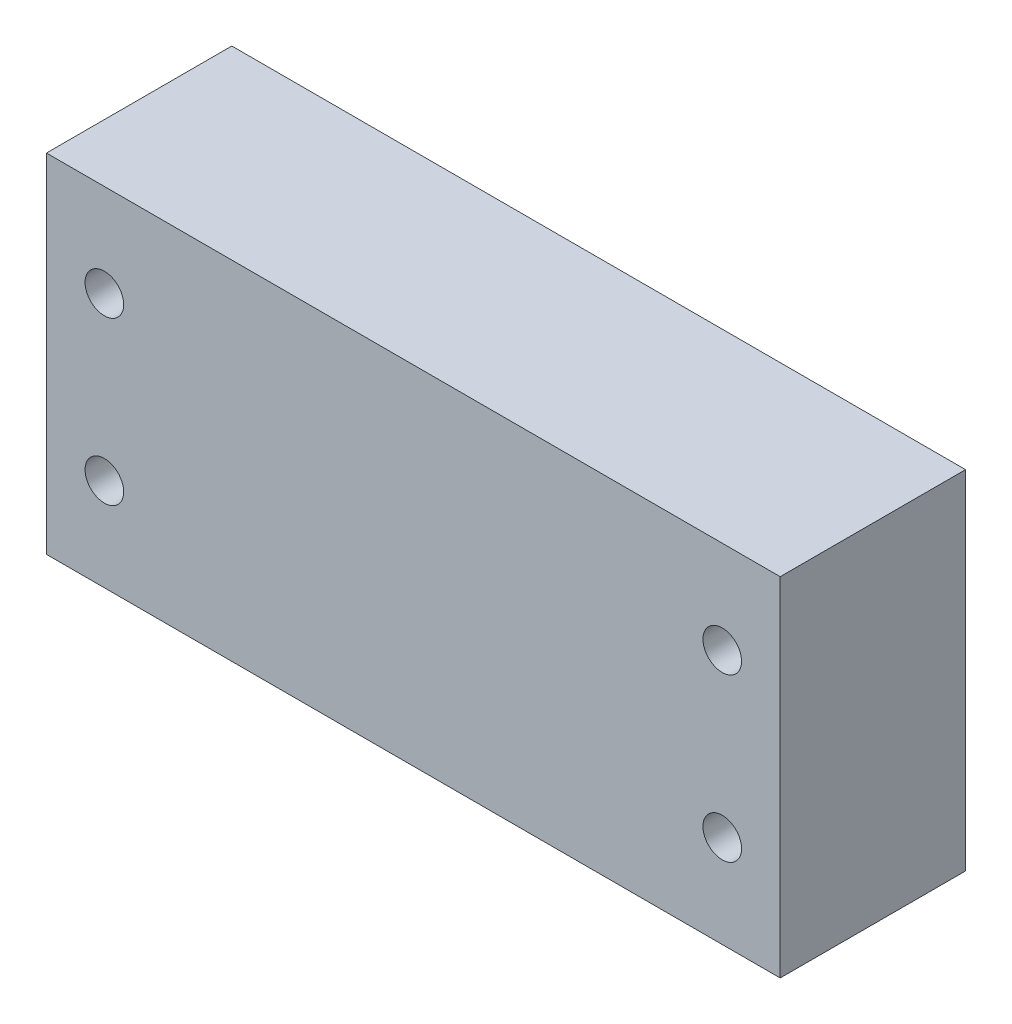
ISO-10303-21;
HEADER;
FILE_DESCRIPTION(('STEP AP214'),'2;1');
FILE_NAME('part.step','',(''),(''),'','','');
FILE_SCHEMA(('AUTOMOTIVE_DESIGN { 1 0 10303 214 1 1 1 1 }'));
ENDSEC;
DATA;
#1=APPLICATION_CONTEXT('core data for automotive mechanical design processes');
#2=APPLICATION_PROTOCOL_DEFINITION('international standard','automotive_design',2000,#1);
#3=PRODUCT_CONTEXT('',#1,'mechanical');
#4=PRODUCT('Part','Part','',(#3));
#5=PRODUCT_RELATED_PRODUCT_CATEGORY('part','',(#4));
#6=PRODUCT_DEFINITION_FORMATION('','',#4);
#7=PRODUCT_DEFINITION_CONTEXT('part definition',#1,'design');
#8=PRODUCT_DEFINITION('design','',#6,#7);
#9=PRODUCT_DEFINITION_SHAPE('','',#8);
#10=(LENGTH_UNIT() NAMED_UNIT(*) SI_UNIT(.MILLI.,.METRE.));
#11=(NAMED_UNIT(*) PLANE_ANGLE_UNIT() SI_UNIT($,.RADIAN.));
#12=(NAMED_UNIT(*) SI_UNIT($,.STERADIAN.) SOLID_ANGLE_UNIT());
#13=UNCERTAINTY_MEASURE_WITH_UNIT(LENGTH_MEASURE(1.E-05),#10,'distance_accuracy_value','');
#14=(GEOMETRIC_REPRESENTATION_CONTEXT(3) GLOBAL_UNCERTAINTY_ASSIGNED_CONTEXT((#13)) GLOBAL_UNIT_ASSIGNED_CONTEXT((#10,
#11,#12)) REPRESENTATION_CONTEXT('',''));
#15=CARTESIAN_POINT('',(0.,0.,0.));
#16=DIRECTION('',(0.,0.,1.));
#17=DIRECTION('',(1.,0.,0.));
#18=AXIS2_PLACEMENT_3D('',#15,#16,#17);
#19=CARTESIAN_POINT('',(47.5,22.5,24.));
#20=DIRECTION('',(-1.,0.,0.));
#21=DIRECTION('',(0.,-1.,0.));
#22=AXIS2_PLACEMENT_3D('',#19,#20,#21);
#23=PLANE('',#22);
#24=DIRECTION('',(0.,1.,0.));
#25=VECTOR('',#24,1.);
#26=CARTESIAN_POINT('',(47.5,22.5,0.));
#27=LINE('',#26,#25);
#28=CARTESIAN_POINT('',(47.5,-22.5,0.));
#29=VERTEX_POINT('',#28);
#30=CARTESIAN_POINT('',(47.5,22.5,0.));
#31=VERTEX_POINT('',#30);
#32=EDGE_CURVE('E96',#29,#31,#27,.T.);
#33=ORIENTED_EDGE('',*,*,#32,.T.);
#34=DIRECTION('',(0.,0.,-1.));
#35=VECTOR('',#34,1.);
#36=CARTESIAN_POINT('',(47.5,22.5,24.));
#37=LINE('',#36,#35);
#38=CARTESIAN_POINT('',(47.5,22.5,24.));
#39=VERTEX_POINT('',#38);
#40=EDGE_CURVE('E11',#39,#31,#37,.T.);
#41=ORIENTED_EDGE('',*,*,#40,.F.);
#42=DIRECTION('',(0.,1.,0.));
#43=VECTOR('',#42,1.);
#44=CARTESIAN_POINT('',(47.5,22.5,24.));
#45=LINE('',#44,#43);
#46=CARTESIAN_POINT('',(47.5,-22.5,24.));
#47=VERTEX_POINT('',#46);
#48=EDGE_CURVE('E84',#47,#39,#45,.T.);
#49=ORIENTED_EDGE('',*,*,#48,.F.);
#50=DIRECTION('',(0.,0.,-1.));
#51=VECTOR('',#50,1.);
#52=CARTESIAN_POINT('',(47.5,-22.5,24.));
#53=LINE('',#52,#51);
#54=EDGE_CURVE('E92',#47,#29,#53,.T.);
#55=ORIENTED_EDGE('',*,*,#54,.T.);
#56=EDGE_LOOP('',(#33,#41,#49,#55));
#57=FACE_BOUND('',#56,.T.);
#58=ADVANCED_FACE('F33',(#57),#23,.F.);
#59=CARTESIAN_POINT('',(-47.5,22.5,24.));
#60=DIRECTION('',(0.,-1.,0.));
#61=DIRECTION('',(0.,0.,-1.));
#62=AXIS2_PLACEMENT_3D('',#59,#60,#61);
#63=PLANE('',#62);
#64=DIRECTION('',(-1.,0.,0.));
#65=VECTOR('',#64,1.);
#66=CARTESIAN_POINT('',(-47.5,22.5,0.));
#67=LINE('',#66,#65);
#68=CARTESIAN_POINT('',(-47.5,22.5,0.));
#69=VERTEX_POINT('',#68);
#70=EDGE_CURVE('E88',#31,#69,#67,.T.);
#71=ORIENTED_EDGE('',*,*,#70,.T.);
#72=DIRECTION('',(0.,0.,-1.));
#73=VECTOR('',#72,1.);
#74=CARTESIAN_POINT('',(-47.5,22.5,24.));
#75=LINE('',#74,#73);
#76=CARTESIAN_POINT('',(-47.5,22.5,24.));
#77=VERTEX_POINT('',#76);
#78=EDGE_CURVE('E41',#77,#69,#75,.T.);
#79=ORIENTED_EDGE('',*,*,#78,.F.);
#80=DIRECTION('',(-1.,0.,0.));
#81=VECTOR('',#80,1.);
#82=CARTESIAN_POINT('',(-47.5,22.5,24.));
#83=LINE('',#82,#81);
#84=EDGE_CURVE('E79',#39,#77,#83,.T.);
#85=ORIENTED_EDGE('',*,*,#84,.F.);
#86=ORIENTED_EDGE('',*,*,#40,.T.);
#87=EDGE_LOOP('',(#71,#79,#85,#86));
#88=FACE_BOUND('',#87,.T.);
#89=ADVANCED_FACE('F87',(#88),#63,.F.);
#90=CARTESIAN_POINT('',(-47.5,22.5,24.));
#91=DIRECTION('',(1.,0.,0.));
#92=DIRECTION('',(0.,0.,-1.));
#93=AXIS2_PLACEMENT_3D('',#90,#91,#92);
#94=PLANE('',#93);
#95=DIRECTION('',(0.,-1.,0.));
#96=VECTOR('',#95,1.);
#97=CARTESIAN_POINT('',(-47.5,22.5,0.));
#98=LINE('',#97,#96);
#99=CARTESIAN_POINT('',(-47.5,-22.5,0.));
#100=VERTEX_POINT('',#99);
#101=EDGE_CURVE('E66',#69,#100,#98,.T.);
#102=ORIENTED_EDGE('',*,*,#101,.T.);
#103=DIRECTION('',(0.,0.,-1.));
#104=VECTOR('',#103,1.);
#105=CARTESIAN_POINT('',(-47.5,-22.5,24.));
#106=LINE('',#105,#104);
#107=CARTESIAN_POINT('',(-47.5,-22.5,24.));
#108=VERTEX_POINT('',#107);
#109=EDGE_CURVE('E89',#108,#100,#106,.T.);
#110=ORIENTED_EDGE('',*,*,#109,.F.);
#111=DIRECTION('',(0.,-1.,0.));
#112=VECTOR('',#111,1.);
#113=CARTESIAN_POINT('',(-47.5,22.5,24.));
#114=LINE('',#113,#112);
#115=EDGE_CURVE('E82',#77,#108,#114,.T.);
#116=ORIENTED_EDGE('',*,*,#115,.F.);
#117=ORIENTED_EDGE('',*,*,#78,.T.);
#118=EDGE_LOOP('',(#102,#110,#116,#117));
#119=FACE_BOUND('',#118,.T.);
#120=ADVANCED_FACE('F90',(#119),#94,.F.);
#121=CARTESIAN_POINT('',(-47.5,-22.5,24.));
#122=DIRECTION('',(0.,1.,0.));
#123=DIRECTION('',(0.,0.,1.));
#124=AXIS2_PLACEMENT_3D('',#121,#122,#123);
#125=PLANE('',#124);
#126=DIRECTION('',(1.,0.,0.));
#127=VECTOR('',#126,1.);
#128=CARTESIAN_POINT('',(-47.5,-22.5,0.));
#129=LINE('',#128,#127);
#130=EDGE_CURVE('E72',#100,#29,#129,.T.);
#131=ORIENTED_EDGE('',*,*,#130,.T.);
#132=ORIENTED_EDGE('',*,*,#54,.F.);
#133=DIRECTION('',(1.,0.,0.));
#134=VECTOR('',#133,1.);
#135=CARTESIAN_POINT('',(-47.5,-22.5,24.));
#136=LINE('',#135,#134);
#137=EDGE_CURVE('E49',#108,#47,#136,.T.);
#138=ORIENTED_EDGE('',*,*,#137,.F.);
#139=ORIENTED_EDGE('',*,*,#109,.T.);
#140=EDGE_LOOP('',(#131,#132,#138,#139));
#141=FACE_BOUND('',#140,.T.);
#142=ADVANCED_FACE('F104',(#141),#125,.F.);
#143=CARTESIAN_POINT('',(0.,0.,24.));
#144=DIRECTION('',(0.,0.,1.));
#145=DIRECTION('',(1.,0.,0.));
#146=AXIS2_PLACEMENT_3D('',#143,#144,#145);
#147=PLANE('',#146);
#148=CARTESIAN_POINT('',(40.,10.5,24.));
#149=DIRECTION('',(0.,0.,1.));
#150=DIRECTION('',(1.,0.,0.));
#151=AXIS2_PLACEMENT_3D('',#148,#149,#150);
#152=CIRCLE('',#151,2.5);
#153=CARTESIAN_POINT('',(42.5,10.5,24.));
#154=VERTEX_POINT('',#153);
#155=EDGE_CURVE('E128',#154,#154,#152,.T.);
#156=ORIENTED_EDGE('',*,*,#155,.F.);
#157=EDGE_LOOP('',(#156));
#158=FACE_BOUND('',#157,.T.);
#159=CARTESIAN_POINT('',(40.,-10.5,24.));
#160=DIRECTION('',(0.,0.,1.));
#161=DIRECTION('',(1.,0.,0.));
#162=AXIS2_PLACEMENT_3D('',#159,#160,#161);
#163=CIRCLE('',#162,2.5);
#164=CARTESIAN_POINT('',(42.5,-10.5,24.));
#165=VERTEX_POINT('',#164);
#166=EDGE_CURVE('E122',#165,#165,#163,.T.);
#167=ORIENTED_EDGE('',*,*,#166,.F.);
#168=EDGE_LOOP('',(#167));
#169=FACE_BOUND('',#168,.T.);
#170=CARTESIAN_POINT('',(-40.,-10.5,24.));
#171=DIRECTION('',(0.,0.,1.));
#172=DIRECTION('',(1.,0.,0.));
#173=AXIS2_PLACEMENT_3D('',#170,#171,#172);
#174=CIRCLE('',#173,2.5);
#175=CARTESIAN_POINT('',(-37.5,-10.5,24.));
#176=VERTEX_POINT('',#175);
#177=EDGE_CURVE('E116',#176,#176,#174,.T.);
#178=ORIENTED_EDGE('',*,*,#177,.F.);
#179=EDGE_LOOP('',(#178));
#180=FACE_BOUND('',#179,.T.);
#181=CARTESIAN_POINT('',(-40.,10.5,24.));
#182=DIRECTION('',(0.,0.,1.));
#183=DIRECTION('',(1.,0.,0.));
#184=AXIS2_PLACEMENT_3D('',#181,#182,#183);
#185=CIRCLE('',#184,2.5);
#186=CARTESIAN_POINT('',(-37.5,10.5,24.));
#187=VERTEX_POINT('',#186);
#188=EDGE_CURVE('E110',#187,#187,#185,.T.);
#189=ORIENTED_EDGE('',*,*,#188,.F.);
#190=EDGE_LOOP('',(#189));
#191=FACE_BOUND('',#190,.T.);
#192=ORIENTED_EDGE('',*,*,#48,.T.);
#193=ORIENTED_EDGE('',*,*,#84,.T.);
#194=ORIENTED_EDGE('',*,*,#115,.T.);
#195=ORIENTED_EDGE('',*,*,#137,.T.);
#196=EDGE_LOOP('',(#192,#193,#194,#195));
#197=FACE_BOUND('',#196,.T.);
#198=ADVANCED_FACE('F80',(#158,#169,#180,#191,#197),#147,.T.);
#199=CARTESIAN_POINT('',(0.,0.,0.));
#200=DIRECTION('',(0.,0.,1.));
#201=DIRECTION('',(1.,0.,0.));
#202=AXIS2_PLACEMENT_3D('',#199,#200,#201);
#203=PLANE('',#202);
#204=CARTESIAN_POINT('',(40.,10.5,0.));
#205=DIRECTION('',(0.,0.,1.));
#206=DIRECTION('',(1.,0.,0.));
#207=AXIS2_PLACEMENT_3D('',#204,#205,#206);
#208=CIRCLE('',#207,2.5);
#209=CARTESIAN_POINT('',(42.5,10.5,0.));
#210=VERTEX_POINT('',#209);
#211=EDGE_CURVE('E125',#210,#210,#208,.T.);
#212=ORIENTED_EDGE('',*,*,#211,.T.);
#213=EDGE_LOOP('',(#212));
#214=FACE_BOUND('',#213,.T.);
#215=CARTESIAN_POINT('',(40.,-10.5,0.));
#216=DIRECTION('',(0.,0.,1.));
#217=DIRECTION('',(1.,0.,0.));
#218=AXIS2_PLACEMENT_3D('',#215,#216,#217);
#219=CIRCLE('',#218,2.5);
#220=CARTESIAN_POINT('',(42.5,-10.5,0.));
#221=VERTEX_POINT('',#220);
#222=EDGE_CURVE('E119',#221,#221,#219,.T.);
#223=ORIENTED_EDGE('',*,*,#222,.T.);
#224=EDGE_LOOP('',(#223));
#225=FACE_BOUND('',#224,.T.);
#226=CARTESIAN_POINT('',(-40.,-10.5,0.));
#227=DIRECTION('',(0.,0.,1.));
#228=DIRECTION('',(1.,0.,0.));
#229=AXIS2_PLACEMENT_3D('',#226,#227,#228);
#230=CIRCLE('',#229,2.5);
#231=CARTESIAN_POINT('',(-37.5,-10.5,0.));
#232=VERTEX_POINT('',#231);
#233=EDGE_CURVE('E113',#232,#232,#230,.T.);
#234=ORIENTED_EDGE('',*,*,#233,.T.);
#235=EDGE_LOOP('',(#234));
#236=FACE_BOUND('',#235,.T.);
#237=CARTESIAN_POINT('',(-40.,10.5,0.));
#238=DIRECTION('',(0.,0.,1.));
#239=DIRECTION('',(1.,0.,0.));
#240=AXIS2_PLACEMENT_3D('',#237,#238,#239);
#241=CIRCLE('',#240,2.5);
#242=CARTESIAN_POINT('',(-37.5,10.5,0.));
#243=VERTEX_POINT('',#242);
#244=EDGE_CURVE('E99',#243,#243,#241,.T.);
#245=ORIENTED_EDGE('',*,*,#244,.T.);
#246=EDGE_LOOP('',(#245));
#247=FACE_BOUND('',#246,.T.);
#248=ORIENTED_EDGE('',*,*,#32,.F.);
#249=ORIENTED_EDGE('',*,*,#130,.F.);
#250=ORIENTED_EDGE('',*,*,#101,.F.);
#251=ORIENTED_EDGE('',*,*,#70,.F.);
#252=EDGE_LOOP('',(#248,#249,#250,#251));
#253=FACE_BOUND('',#252,.T.);
#254=ADVANCED_FACE('F107',(#214,#225,#236,#247,#253),#203,.F.);
#255=CARTESIAN_POINT('',(-40.,10.5,0.));
#256=DIRECTION('',(0.,0.,1.));
#257=DIRECTION('',(1.,0.,0.));
#258=AXIS2_PLACEMENT_3D('',#255,#256,#257);
#259=CYLINDRICAL_SURFACE('',#258,2.5);
#260=ORIENTED_EDGE('',*,*,#244,.F.);
#261=EDGE_LOOP('',(#260));
#262=FACE_BOUND('',#261,.T.);
#263=ORIENTED_EDGE('',*,*,#188,.T.);
#264=EDGE_LOOP('',(#263));
#265=FACE_BOUND('',#264,.T.);
#266=ADVANCED_FACE('F152',(#262,#265),#259,.F.);
#267=CARTESIAN_POINT('',(-40.,-10.5,0.));
#268=DIRECTION('',(0.,0.,1.));
#269=DIRECTION('',(1.,0.,0.));
#270=AXIS2_PLACEMENT_3D('',#267,#268,#269);
#271=CYLINDRICAL_SURFACE('',#270,2.5);
#272=ORIENTED_EDGE('',*,*,#233,.F.);
#273=EDGE_LOOP('',(#272));
#274=FACE_BOUND('',#273,.T.);
#275=ORIENTED_EDGE('',*,*,#177,.T.);
#276=EDGE_LOOP('',(#275));
#277=FACE_BOUND('',#276,.T.);
#278=ADVANCED_FACE('F154',(#274,#277),#271,.F.);
#279=CARTESIAN_POINT('',(40.,-10.5,0.));
#280=DIRECTION('',(0.,0.,1.));
#281=DIRECTION('',(1.,0.,0.));
#282=AXIS2_PLACEMENT_3D('',#279,#280,#281);
#283=CYLINDRICAL_SURFACE('',#282,2.5);
#284=ORIENTED_EDGE('',*,*,#222,.F.);
#285=EDGE_LOOP('',(#284));
#286=FACE_BOUND('',#285,.T.);
#287=ORIENTED_EDGE('',*,*,#166,.T.);
#288=EDGE_LOOP('',(#287));
#289=FACE_BOUND('',#288,.T.);
#290=ADVANCED_FACE('F139',(#286,#289),#283,.F.);
#291=CARTESIAN_POINT('',(40.,10.5,0.));
#292=DIRECTION('',(0.,0.,1.));
#293=DIRECTION('',(1.,0.,0.));
#294=AXIS2_PLACEMENT_3D('',#291,#292,#293);
#295=CYLINDRICAL_SURFACE('',#294,2.5);
#296=ORIENTED_EDGE('',*,*,#211,.F.);
#297=EDGE_LOOP('',(#296));
#298=FACE_BOUND('',#297,.T.);
#299=ORIENTED_EDGE('',*,*,#155,.T.);
#300=EDGE_LOOP('',(#299));
#301=FACE_BOUND('',#300,.T.);
#302=ADVANCED_FACE('F136',(#298,#301),#295,.F.);
#303=CLOSED_SHELL('',(#58,#89,#120,#142,#198,#254,#266,#278,#290,#302));
#304=MANIFOLD_SOLID_BREP('B2',#303);
#305=ADVANCED_BREP_SHAPE_REPRESENTATION('',(#18,#304),#14);
#306=SHAPE_DEFINITION_REPRESENTATION(#9,#305);
ENDSEC;
END-ISO-10303-21;
